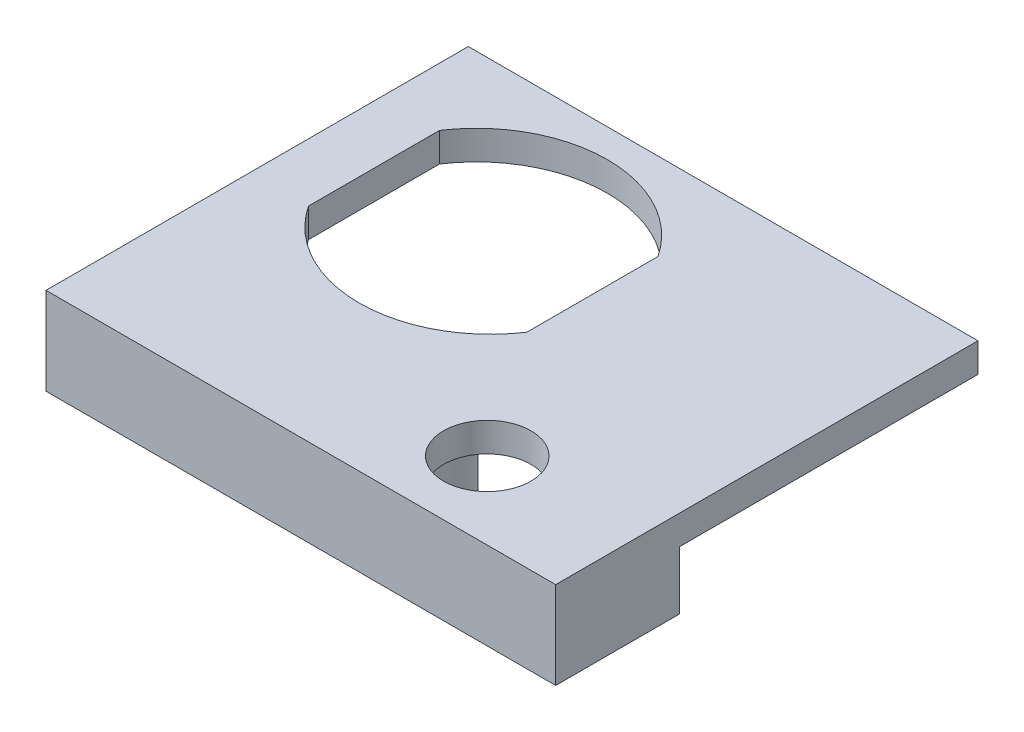
ISO-10303-21;
HEADER;
FILE_DESCRIPTION(('STEP AP214'),'2;1');
FILE_NAME('part.step','',(''),(''),'','','');
FILE_SCHEMA(('AUTOMOTIVE_DESIGN { 1 0 10303 214 1 1 1 1 }'));
ENDSEC;
DATA;
#1=APPLICATION_CONTEXT('core data for automotive mechanical design processes');
#2=APPLICATION_PROTOCOL_DEFINITION('international standard','automotive_design',2000,#1);
#3=PRODUCT_CONTEXT('',#1,'mechanical');
#4=PRODUCT('Part','Part','',(#3));
#5=PRODUCT_RELATED_PRODUCT_CATEGORY('part','',(#4));
#6=PRODUCT_DEFINITION_FORMATION('','',#4);
#7=PRODUCT_DEFINITION_CONTEXT('part definition',#1,'design');
#8=PRODUCT_DEFINITION('design','',#6,#7);
#9=PRODUCT_DEFINITION_SHAPE('','',#8);
#10=(LENGTH_UNIT() NAMED_UNIT(*) SI_UNIT(.MILLI.,.METRE.));
#11=(NAMED_UNIT(*) PLANE_ANGLE_UNIT() SI_UNIT($,.RADIAN.));
#12=(NAMED_UNIT(*) SI_UNIT($,.STERADIAN.) SOLID_ANGLE_UNIT());
#13=UNCERTAINTY_MEASURE_WITH_UNIT(LENGTH_MEASURE(1.E-05),#10,'distance_accuracy_value','');
#14=(GEOMETRIC_REPRESENTATION_CONTEXT(3) GLOBAL_UNCERTAINTY_ASSIGNED_CONTEXT((#13)) GLOBAL_UNIT_ASSIGNED_CONTEXT((#10,
#11,#12)) REPRESENTATION_CONTEXT('',''));
#15=CARTESIAN_POINT('',(0.,0.,0.));
#16=DIRECTION('',(0.,0.,1.));
#17=DIRECTION('',(1.,0.,0.));
#18=AXIS2_PLACEMENT_3D('',#15,#16,#17);
#19=CARTESIAN_POINT('',(0.,0.,0.));
#20=DIRECTION('',(0.,1.,0.));
#21=DIRECTION('',(0.,0.,1.));
#22=AXIS2_PLACEMENT_3D('',#19,#20,#21);
#23=PLANE('',#22);
#24=DIRECTION('',(1.,0.,0.));
#25=VECTOR('',#24,1.);
#26=CARTESIAN_POINT('',(5.67093727122986,0.,3.));
#27=LINE('',#26,#25);
#28=CARTESIAN_POINT('',(5.67093727122986,0.,3.));
#29=VERTEX_POINT('',#28);
#30=CARTESIAN_POINT('',(8.75,0.,3.));
#31=VERTEX_POINT('',#30);
#32=EDGE_CURVE('E183',#29,#31,#27,.T.);
#33=ORIENTED_EDGE('',*,*,#32,.F.);
#34=CARTESIAN_POINT('',(3.75,0.,4.6));
#35=DIRECTION('',(0.,1.,0.));
#36=DIRECTION('',(0.,0.,-1.));
#37=AXIS2_PLACEMENT_3D('',#34,#35,#36);
#38=CIRCLE('',#37,2.5);
#39=CARTESIAN_POINT('',(1.82906272877015,0.,3.));
#40=VERTEX_POINT('',#39);
#41=EDGE_CURVE('E173',#40,#29,#38,.T.);
#42=ORIENTED_EDGE('',*,*,#41,.F.);
#43=DIRECTION('',(1.,0.,0.));
#44=VECTOR('',#43,1.);
#45=CARTESIAN_POINT('',(-8.75,0.,3.));
#46=LINE('',#45,#44);
#47=CARTESIAN_POINT('',(-8.75,0.,3.));
#48=VERTEX_POINT('',#47);
#49=EDGE_CURVE('E170',#48,#40,#46,.T.);
#50=ORIENTED_EDGE('',*,*,#49,.F.);
#51=DIRECTION('',(0.,0.,1.));
#52=VECTOR('',#51,1.);
#53=CARTESIAN_POINT('',(-8.75,0.,-7.25));
#54=LINE('',#53,#52);
#55=CARTESIAN_POINT('',(-8.75,0.,-7.25));
#56=VERTEX_POINT('',#55);
#57=EDGE_CURVE('E246',#56,#48,#54,.T.);
#58=ORIENTED_EDGE('',*,*,#57,.F.);
#59=DIRECTION('',(-1.,0.,0.));
#60=VECTOR('',#59,1.);
#61=CARTESIAN_POINT('',(-8.75,0.,-7.25));
#62=LINE('',#61,#60);
#63=CARTESIAN_POINT('',(8.75,0.,-7.25));
#64=VERTEX_POINT('',#63);
#65=EDGE_CURVE('E253',#64,#56,#62,.T.);
#66=ORIENTED_EDGE('',*,*,#65,.F.);
#67=DIRECTION('',(0.,0.,-1.));
#68=VECTOR('',#67,1.);
#69=CARTESIAN_POINT('',(8.75,0.,-7.25));
#70=LINE('',#69,#68);
#71=EDGE_CURVE('E262',#31,#64,#70,.T.);
#72=ORIENTED_EDGE('',*,*,#71,.F.);
#73=EDGE_LOOP('',(#33,#42,#50,#58,#66,#72));
#74=FACE_BOUND('',#73,.T.);
#75=CARTESIAN_POINT('',(3.75,0.,4.6));
#76=DIRECTION('',(0.,1.,0.));
#77=DIRECTION('',(0.,0.,1.));
#78=AXIS2_PLACEMENT_3D('',#75,#76,#77);
#79=CIRCLE('',#78,1.5);
#80=CARTESIAN_POINT('',(3.75,0.,6.1));
#81=VERTEX_POINT('',#80);
#82=EDGE_CURVE('E242',#81,#81,#79,.T.);
#83=ORIENTED_EDGE('',*,*,#82,.T.);
#84=EDGE_LOOP('',(#83));
#85=FACE_BOUND('',#84,.T.);
#86=CARTESIAN_POINT('',(-3.,0.,-1.77506281446689));
#87=DIRECTION('',(0.,1.,0.));
#88=DIRECTION('',(0.,0.,-1.));
#89=AXIS2_PLACEMENT_3D('',#86,#87,#88);
#90=CIRCLE('',#89,4.5);
#91=CARTESIAN_POINT('',(0.749999999999996,0.,-4.26253140723344));
#92=VERTEX_POINT('',#91);
#93=CARTESIAN_POINT('',(-6.75,0.,-4.26253140723344));
#94=VERTEX_POINT('',#93);
#95=EDGE_CURVE('E211',#92,#94,#90,.T.);
#96=ORIENTED_EDGE('',*,*,#95,.T.);
#97=DIRECTION('',(0.,0.,1.));
#98=VECTOR('',#97,1.);
#99=CARTESIAN_POINT('',(-6.75,0.,-4.26253140723344));
#100=LINE('',#99,#98);
#101=CARTESIAN_POINT('',(-6.74999999999999,0.,0.237468592766558));
#102=VERTEX_POINT('',#101);
#103=EDGE_CURVE('E225',#94,#102,#100,.T.);
#104=ORIENTED_EDGE('',*,*,#103,.T.);
#105=CARTESIAN_POINT('',(-3.,0.,-2.25));
#106=DIRECTION('',(0.,1.,0.));
#107=DIRECTION('',(0.,0.,1.));
#108=AXIS2_PLACEMENT_3D('',#105,#106,#107);
#109=CIRCLE('',#108,4.5);
#110=CARTESIAN_POINT('',(0.749999999999998,0.,0.237468592766558));
#111=VERTEX_POINT('',#110);
#112=EDGE_CURVE('E228',#102,#111,#109,.T.);
#113=ORIENTED_EDGE('',*,*,#112,.T.);
#114=DIRECTION('',(0.,0.,-1.));
#115=VECTOR('',#114,1.);
#116=CARTESIAN_POINT('',(0.749999999999996,0.,-4.26253140723344));
#117=LINE('',#116,#115);
#118=EDGE_CURVE('E215',#111,#92,#117,.T.);
#119=ORIENTED_EDGE('',*,*,#118,.T.);
#120=EDGE_LOOP('',(#96,#104,#113,#119));
#121=FACE_BOUND('',#120,.T.);
#122=DIRECTION('',(0.,0.,-1.));
#123=VECTOR('',#122,1.);
#124=CARTESIAN_POINT('',(1.75,0.,2.25));
#125=LINE('',#124,#123);
#126=CARTESIAN_POINT('',(1.75,0.,2.25));
#127=VERTEX_POINT('',#126);
#128=CARTESIAN_POINT('',(1.75,0.,-3.75));
#129=VERTEX_POINT('',#128);
#130=EDGE_CURVE('E169',#127,#129,#125,.T.);
#131=ORIENTED_EDGE('',*,*,#130,.F.);
#132=DIRECTION('',(-1.,0.,0.));
#133=VECTOR('',#132,1.);
#134=CARTESIAN_POINT('',(1.75,0.,2.25));
#135=LINE('',#134,#133);
#136=CARTESIAN_POINT('',(3.75,0.,2.25));
#137=VERTEX_POINT('',#136);
#138=EDGE_CURVE('E166',#137,#127,#135,.T.);
#139=ORIENTED_EDGE('',*,*,#138,.F.);
#140=DIRECTION('',(0.,0.,1.));
#141=VECTOR('',#140,1.);
#142=CARTESIAN_POINT('',(3.75,0.,2.25));
#143=LINE('',#142,#141);
#144=CARTESIAN_POINT('',(3.75,0.,-3.75));
#145=VERTEX_POINT('',#144);
#146=EDGE_CURVE('E57',#145,#137,#143,.T.);
#147=ORIENTED_EDGE('',*,*,#146,.F.);
#148=DIRECTION('',(1.,0.,0.));
#149=VECTOR('',#148,1.);
#150=CARTESIAN_POINT('',(1.75,0.,-3.75));
#151=LINE('',#150,#149);
#152=EDGE_CURVE('E52',#129,#145,#151,.T.);
#153=ORIENTED_EDGE('',*,*,#152,.F.);
#154=EDGE_LOOP('',(#131,#139,#147,#153));
#155=FACE_BOUND('',#154,.T.);
#156=ADVANCED_FACE('F37',(#74,#85,#121,#155),#23,.F.);
#157=CARTESIAN_POINT('',(0.,1.,0.));
#158=DIRECTION('',(0.,1.,0.));
#159=DIRECTION('',(0.,0.,1.));
#160=AXIS2_PLACEMENT_3D('',#157,#158,#159);
#161=PLANE('',#160);
#162=DIRECTION('',(0.,0.,1.));
#163=VECTOR('',#162,1.);
#164=CARTESIAN_POINT('',(-8.75,1.,-7.25));
#165=LINE('',#164,#163);
#166=CARTESIAN_POINT('',(-8.75,1.,-7.25));
#167=VERTEX_POINT('',#166);
#168=CARTESIAN_POINT('',(-8.75,1.,7.25));
#169=VERTEX_POINT('',#168);
#170=EDGE_CURVE('E249',#167,#169,#165,.T.);
#171=ORIENTED_EDGE('',*,*,#170,.T.);
#172=DIRECTION('',(1.,0.,0.));
#173=VECTOR('',#172,1.);
#174=CARTESIAN_POINT('',(-8.75,1.,7.25));
#175=LINE('',#174,#173);
#176=CARTESIAN_POINT('',(8.75,1.,7.25));
#177=VERTEX_POINT('',#176);
#178=EDGE_CURVE('E252',#169,#177,#175,.T.);
#179=ORIENTED_EDGE('',*,*,#178,.T.);
#180=DIRECTION('',(0.,0.,-1.));
#181=VECTOR('',#180,1.);
#182=CARTESIAN_POINT('',(8.75,1.,-7.25));
#183=LINE('',#182,#181);
#184=CARTESIAN_POINT('',(8.75,1.,-7.25));
#185=VERTEX_POINT('',#184);
#186=EDGE_CURVE('E255',#177,#185,#183,.T.);
#187=ORIENTED_EDGE('',*,*,#186,.T.);
#188=DIRECTION('',(-1.,0.,0.));
#189=VECTOR('',#188,1.);
#190=CARTESIAN_POINT('',(0.749999999999995,1.,-7.25));
#191=LINE('',#190,#189);
#192=EDGE_CURVE('E257',#185,#167,#191,.T.);
#193=ORIENTED_EDGE('',*,*,#192,.T.);
#194=EDGE_LOOP('',(#171,#179,#187,#193));
#195=FACE_BOUND('',#194,.T.);
#196=CARTESIAN_POINT('',(3.75,1.,4.6));
#197=DIRECTION('',(0.,1.,0.));
#198=DIRECTION('',(0.,0.,1.));
#199=AXIS2_PLACEMENT_3D('',#196,#197,#198);
#200=CIRCLE('',#199,1.5);
#201=CARTESIAN_POINT('',(3.75,1.,6.1));
#202=VERTEX_POINT('',#201);
#203=EDGE_CURVE('E243',#202,#202,#200,.T.);
#204=ORIENTED_EDGE('',*,*,#203,.F.);
#205=EDGE_LOOP('',(#204));
#206=FACE_BOUND('',#205,.T.);
#207=DIRECTION('',(0.,0.,1.));
#208=VECTOR('',#207,1.);
#209=CARTESIAN_POINT('',(-6.75,1.,-4.26253140723344));
#210=LINE('',#209,#208);
#211=CARTESIAN_POINT('',(-6.75,1.,-4.26253140723344));
#212=VERTEX_POINT('',#211);
#213=CARTESIAN_POINT('',(-6.74999999999999,1.,0.237468592766558));
#214=VERTEX_POINT('',#213);
#215=EDGE_CURVE('E214',#212,#214,#210,.T.);
#216=ORIENTED_EDGE('',*,*,#215,.F.);
#217=CARTESIAN_POINT('',(-3.,1.,-1.77506281446689));
#218=DIRECTION('',(0.,1.,0.));
#219=DIRECTION('',(0.,0.,-1.));
#220=AXIS2_PLACEMENT_3D('',#217,#218,#219);
#221=CIRCLE('',#220,4.5);
#222=CARTESIAN_POINT('',(0.749999999999996,1.,-4.26253140723344));
#223=VERTEX_POINT('',#222);
#224=EDGE_CURVE('E212',#223,#212,#221,.T.);
#225=ORIENTED_EDGE('',*,*,#224,.F.);
#226=DIRECTION('',(0.,0.,-1.));
#227=VECTOR('',#226,1.);
#228=CARTESIAN_POINT('',(0.749999999999996,1.,-4.26253140723344));
#229=LINE('',#228,#227);
#230=CARTESIAN_POINT('',(0.749999999999998,1.,0.237468592766558));
#231=VERTEX_POINT('',#230);
#232=EDGE_CURVE('E220',#231,#223,#229,.T.);
#233=ORIENTED_EDGE('',*,*,#232,.F.);
#234=CARTESIAN_POINT('',(-3.,1.,-2.25));
#235=DIRECTION('',(0.,1.,0.));
#236=DIRECTION('',(0.,0.,1.));
#237=AXIS2_PLACEMENT_3D('',#234,#235,#236);
#238=CIRCLE('',#237,4.5);
#239=EDGE_CURVE('E217',#214,#231,#238,.T.);
#240=ORIENTED_EDGE('',*,*,#239,.F.);
#241=EDGE_LOOP('',(#216,#225,#233,#240));
#242=FACE_BOUND('',#241,.T.);
#243=ADVANCED_FACE('F305',(#195,#206,#242),#161,.T.);
#244=CARTESIAN_POINT('',(-8.75,1.,-7.25));
#245=DIRECTION('',(1.,0.,0.));
#246=DIRECTION('',(0.,0.,-1.));
#247=AXIS2_PLACEMENT_3D('',#244,#245,#246);
#248=PLANE('',#247);
#249=ORIENTED_EDGE('',*,*,#57,.T.);
#250=DIRECTION('',(0.,1.,0.));
#251=VECTOR('',#250,1.);
#252=CARTESIAN_POINT('',(-8.75,-2.,3.));
#253=LINE('',#252,#251);
#254=CARTESIAN_POINT('',(-8.75,-2.,3.));
#255=VERTEX_POINT('',#254);
#256=EDGE_CURVE('E208',#255,#48,#253,.T.);
#257=ORIENTED_EDGE('',*,*,#256,.F.);
#258=DIRECTION('',(0.,0.,-1.));
#259=VECTOR('',#258,1.);
#260=CARTESIAN_POINT('',(-8.75,-2.,7.25));
#261=LINE('',#260,#259);
#262=CARTESIAN_POINT('',(-8.75,-2.,7.25));
#263=VERTEX_POINT('',#262);
#264=EDGE_CURVE('E179',#263,#255,#261,.T.);
#265=ORIENTED_EDGE('',*,*,#264,.F.);
#266=DIRECTION('',(0.,-1.,0.));
#267=VECTOR('',#266,1.);
#268=CARTESIAN_POINT('',(-8.75,1.,7.25));
#269=LINE('',#268,#267);
#270=EDGE_CURVE('E11',#169,#263,#269,.T.);
#271=ORIENTED_EDGE('',*,*,#270,.F.);
#272=ORIENTED_EDGE('',*,*,#170,.F.);
#273=DIRECTION('',(0.,-1.,0.));
#274=VECTOR('',#273,1.);
#275=CARTESIAN_POINT('',(-8.75,1.,-7.25));
#276=LINE('',#275,#274);
#277=EDGE_CURVE('E259',#167,#56,#276,.T.);
#278=ORIENTED_EDGE('',*,*,#277,.T.);
#279=EDGE_LOOP('',(#249,#257,#265,#271,#272,#278));
#280=FACE_BOUND('',#279,.T.);
#281=ADVANCED_FACE('F39',(#280),#248,.F.);
#282=CARTESIAN_POINT('',(-8.75,1.,7.25));
#283=DIRECTION('',(0.,0.,-1.));
#284=DIRECTION('',(-1.,0.,0.));
#285=AXIS2_PLACEMENT_3D('',#282,#283,#284);
#286=PLANE('',#285);
#287=ORIENTED_EDGE('',*,*,#270,.T.);
#288=DIRECTION('',(-1.,0.,0.));
#289=VECTOR('',#288,1.);
#290=CARTESIAN_POINT('',(-8.75,-2.,7.25));
#291=LINE('',#290,#289);
#292=CARTESIAN_POINT('',(8.75,-2.,7.25));
#293=VERTEX_POINT('',#292);
#294=EDGE_CURVE('E192',#293,#263,#291,.T.);
#295=ORIENTED_EDGE('',*,*,#294,.F.);
#296=DIRECTION('',(0.,-1.,0.));
#297=VECTOR('',#296,1.);
#298=CARTESIAN_POINT('',(8.75,1.,7.25));
#299=LINE('',#298,#297);
#300=EDGE_CURVE('E45',#177,#293,#299,.T.);
#301=ORIENTED_EDGE('',*,*,#300,.F.);
#302=ORIENTED_EDGE('',*,*,#178,.F.);
#303=EDGE_LOOP('',(#287,#295,#301,#302));
#304=FACE_BOUND('',#303,.T.);
#305=ADVANCED_FACE('F282',(#304),#286,.F.);
#306=CARTESIAN_POINT('',(8.75,1.,-7.25));
#307=DIRECTION('',(-1.,0.,0.));
#308=DIRECTION('',(0.,0.,1.));
#309=AXIS2_PLACEMENT_3D('',#306,#307,#308);
#310=PLANE('',#309);
#311=ORIENTED_EDGE('',*,*,#300,.T.);
#312=DIRECTION('',(0.,0.,1.));
#313=VECTOR('',#312,1.);
#314=CARTESIAN_POINT('',(8.75,-2.,7.25));
#315=LINE('',#314,#313);
#316=CARTESIAN_POINT('',(8.75,-2.,3.));
#317=VERTEX_POINT('',#316);
#318=EDGE_CURVE('E189',#317,#293,#315,.T.);
#319=ORIENTED_EDGE('',*,*,#318,.F.);
#320=DIRECTION('',(0.,1.,0.));
#321=VECTOR('',#320,1.);
#322=CARTESIAN_POINT('',(8.75,-2.,3.));
#323=LINE('',#322,#321);
#324=EDGE_CURVE('E194',#317,#31,#323,.T.);
#325=ORIENTED_EDGE('',*,*,#324,.T.);
#326=ORIENTED_EDGE('',*,*,#71,.T.);
#327=DIRECTION('',(0.,-1.,0.));
#328=VECTOR('',#327,1.);
#329=CARTESIAN_POINT('',(8.75,1.,-7.25));
#330=LINE('',#329,#328);
#331=EDGE_CURVE('E267',#185,#64,#330,.T.);
#332=ORIENTED_EDGE('',*,*,#331,.F.);
#333=ORIENTED_EDGE('',*,*,#186,.F.);
#334=EDGE_LOOP('',(#311,#319,#325,#326,#332,#333));
#335=FACE_BOUND('',#334,.T.);
#336=ADVANCED_FACE('F273',(#335),#310,.F.);
#337=CARTESIAN_POINT('',(-8.75,1.,-7.25));
#338=DIRECTION('',(0.,0.,1.));
#339=DIRECTION('',(1.,0.,0.));
#340=AXIS2_PLACEMENT_3D('',#337,#338,#339);
#341=PLANE('',#340);
#342=ORIENTED_EDGE('',*,*,#65,.T.);
#343=ORIENTED_EDGE('',*,*,#277,.F.);
#344=ORIENTED_EDGE('',*,*,#192,.F.);
#345=ORIENTED_EDGE('',*,*,#331,.T.);
#346=EDGE_LOOP('',(#342,#343,#344,#345));
#347=FACE_BOUND('',#346,.T.);
#348=ADVANCED_FACE('F303',(#347),#341,.F.);
#349=CARTESIAN_POINT('',(3.75,1.,4.6));
#350=DIRECTION('',(0.,-1.,0.));
#351=DIRECTION('',(0.,0.,-1.));
#352=AXIS2_PLACEMENT_3D('',#349,#350,#351);
#353=CYLINDRICAL_SURFACE('',#352,1.5);
#354=ORIENTED_EDGE('',*,*,#203,.T.);
#355=EDGE_LOOP('',(#354));
#356=FACE_BOUND('',#355,.T.);
#357=ORIENTED_EDGE('',*,*,#82,.F.);
#358=EDGE_LOOP('',(#357));
#359=FACE_BOUND('',#358,.T.);
#360=ADVANCED_FACE('F345',(#356,#359),#353,.F.);
#361=CARTESIAN_POINT('',(-3.,1.,-1.77506281446689));
#362=DIRECTION('',(0.,-1.,0.));
#363=DIRECTION('',(0.,0.,-1.));
#364=AXIS2_PLACEMENT_3D('',#361,#362,#363);
#365=CYLINDRICAL_SURFACE('',#364,4.5);
#366=ORIENTED_EDGE('',*,*,#95,.F.);
#367=DIRECTION('',(0.,-1.,0.));
#368=VECTOR('',#367,1.);
#369=CARTESIAN_POINT('',(0.749999999999996,1.,-4.26253140723344));
#370=LINE('',#369,#368);
#371=EDGE_CURVE('E222',#223,#92,#370,.T.);
#372=ORIENTED_EDGE('',*,*,#371,.F.);
#373=ORIENTED_EDGE('',*,*,#224,.T.);
#374=DIRECTION('',(0.,-1.,0.));
#375=VECTOR('',#374,1.);
#376=CARTESIAN_POINT('',(-6.75,1.,-4.26253140723344));
#377=LINE('',#376,#375);
#378=EDGE_CURVE('E239',#212,#94,#377,.T.);
#379=ORIENTED_EDGE('',*,*,#378,.T.);
#380=EDGE_LOOP('',(#366,#372,#373,#379));
#381=FACE_BOUND('',#380,.T.);
#382=ADVANCED_FACE('F325',(#381),#365,.F.);
#383=CARTESIAN_POINT('',(-6.75,1.,-4.26253140723344));
#384=DIRECTION('',(1.,0.,0.));
#385=DIRECTION('',(0.,0.,-1.));
#386=AXIS2_PLACEMENT_3D('',#383,#384,#385);
#387=PLANE('',#386);
#388=ORIENTED_EDGE('',*,*,#103,.F.);
#389=ORIENTED_EDGE('',*,*,#378,.F.);
#390=ORIENTED_EDGE('',*,*,#215,.T.);
#391=DIRECTION('',(0.,-1.,0.));
#392=VECTOR('',#391,1.);
#393=CARTESIAN_POINT('',(-6.74999999999999,1.,0.237468592766558));
#394=LINE('',#393,#392);
#395=EDGE_CURVE('E237',#214,#102,#394,.T.);
#396=ORIENTED_EDGE('',*,*,#395,.T.);
#397=EDGE_LOOP('',(#388,#389,#390,#396));
#398=FACE_BOUND('',#397,.T.);
#399=ADVANCED_FACE('F318',(#398),#387,.T.);
#400=CARTESIAN_POINT('',(-3.,1.,-2.25));
#401=DIRECTION('',(0.,-1.,0.));
#402=DIRECTION('',(0.,0.,-1.));
#403=AXIS2_PLACEMENT_3D('',#400,#401,#402);
#404=CYLINDRICAL_SURFACE('',#403,4.5);
#405=ORIENTED_EDGE('',*,*,#112,.F.);
#406=ORIENTED_EDGE('',*,*,#395,.F.);
#407=ORIENTED_EDGE('',*,*,#239,.T.);
#408=DIRECTION('',(0.,-1.,0.));
#409=VECTOR('',#408,1.);
#410=CARTESIAN_POINT('',(0.749999999999998,1.,0.237468592766558));
#411=LINE('',#410,#409);
#412=EDGE_CURVE('E235',#231,#111,#411,.T.);
#413=ORIENTED_EDGE('',*,*,#412,.T.);
#414=EDGE_LOOP('',(#405,#406,#407,#413));
#415=FACE_BOUND('',#414,.T.);
#416=ADVANCED_FACE('F321',(#415),#404,.F.);
#417=CARTESIAN_POINT('',(0.749999999999996,1.,-4.26253140723344));
#418=DIRECTION('',(-1.,0.,0.));
#419=DIRECTION('',(0.,0.,1.));
#420=AXIS2_PLACEMENT_3D('',#417,#418,#419);
#421=PLANE('',#420);
#422=ORIENTED_EDGE('',*,*,#118,.F.);
#423=ORIENTED_EDGE('',*,*,#412,.F.);
#424=ORIENTED_EDGE('',*,*,#232,.T.);
#425=ORIENTED_EDGE('',*,*,#371,.T.);
#426=EDGE_LOOP('',(#422,#423,#424,#425));
#427=FACE_BOUND('',#426,.T.);
#428=ADVANCED_FACE('F328',(#427),#421,.T.);
#429=CARTESIAN_POINT('',(-8.75,-2.,3.));
#430=DIRECTION('',(0.,0.,1.));
#431=DIRECTION('',(1.,0.,0.));
#432=AXIS2_PLACEMENT_3D('',#429,#430,#431);
#433=PLANE('',#432);
#434=ORIENTED_EDGE('',*,*,#49,.T.);
#435=DIRECTION('',(0.,1.,0.));
#436=VECTOR('',#435,1.);
#437=CARTESIAN_POINT('',(1.82906272877015,-2.,3.));
#438=LINE('',#437,#436);
#439=CARTESIAN_POINT('',(1.82906272877015,-2.,3.));
#440=VERTEX_POINT('',#439);
#441=EDGE_CURVE('E205',#440,#40,#438,.T.);
#442=ORIENTED_EDGE('',*,*,#441,.F.);
#443=DIRECTION('',(1.,0.,0.));
#444=VECTOR('',#443,1.);
#445=CARTESIAN_POINT('',(-8.75,-2.,3.));
#446=LINE('',#445,#444);
#447=EDGE_CURVE('E182',#255,#440,#446,.T.);
#448=ORIENTED_EDGE('',*,*,#447,.F.);
#449=ORIENTED_EDGE('',*,*,#256,.T.);
#450=EDGE_LOOP('',(#434,#442,#448,#449));
#451=FACE_BOUND('',#450,.T.);
#452=ADVANCED_FACE('F291',(#451),#433,.F.);
#453=CARTESIAN_POINT('',(3.75,-2.,4.6));
#454=DIRECTION('',(0.,1.,0.));
#455=DIRECTION('',(0.,0.,1.));
#456=AXIS2_PLACEMENT_3D('',#453,#454,#455);
#457=CYLINDRICAL_SURFACE('',#456,2.5);
#458=ORIENTED_EDGE('',*,*,#41,.T.);
#459=DIRECTION('',(0.,1.,0.));
#460=VECTOR('',#459,1.);
#461=CARTESIAN_POINT('',(5.67093727122986,-2.,3.));
#462=LINE('',#461,#460);
#463=CARTESIAN_POINT('',(5.67093727122986,-2.,3.));
#464=VERTEX_POINT('',#463);
#465=EDGE_CURVE('E202',#464,#29,#462,.T.);
#466=ORIENTED_EDGE('',*,*,#465,.F.);
#467=CARTESIAN_POINT('',(3.75,-2.,4.6));
#468=DIRECTION('',(0.,1.,0.));
#469=DIRECTION('',(0.,0.,-1.));
#470=AXIS2_PLACEMENT_3D('',#467,#468,#469);
#471=CIRCLE('',#470,2.5);
#472=EDGE_CURVE('E185',#440,#464,#471,.T.);
#473=ORIENTED_EDGE('',*,*,#472,.F.);
#474=ORIENTED_EDGE('',*,*,#441,.T.);
#475=EDGE_LOOP('',(#458,#466,#473,#474));
#476=FACE_BOUND('',#475,.T.);
#477=ADVANCED_FACE('F293',(#476),#457,.F.);
#478=CARTESIAN_POINT('',(5.67093727122986,-2.,3.));
#479=DIRECTION('',(0.,0.,1.));
#480=DIRECTION('',(1.,0.,0.));
#481=AXIS2_PLACEMENT_3D('',#478,#479,#480);
#482=PLANE('',#481);
#483=ORIENTED_EDGE('',*,*,#32,.T.);
#484=ORIENTED_EDGE('',*,*,#324,.F.);
#485=DIRECTION('',(1.,0.,0.));
#486=VECTOR('',#485,1.);
#487=CARTESIAN_POINT('',(5.67093727122986,-2.,3.));
#488=LINE('',#487,#486);
#489=EDGE_CURVE('E187',#464,#317,#488,.T.);
#490=ORIENTED_EDGE('',*,*,#489,.F.);
#491=ORIENTED_EDGE('',*,*,#465,.T.);
#492=EDGE_LOOP('',(#483,#484,#490,#491));
#493=FACE_BOUND('',#492,.T.);
#494=ADVANCED_FACE('F295',(#493),#482,.F.);
#495=CARTESIAN_POINT('',(3.75,-2.,4.6));
#496=DIRECTION('',(0.,-1.,0.));
#497=DIRECTION('',(0.,0.,-1.));
#498=AXIS2_PLACEMENT_3D('',#495,#496,#497);
#499=PLANE('',#498);
#500=ORIENTED_EDGE('',*,*,#264,.T.);
#501=ORIENTED_EDGE('',*,*,#447,.T.);
#502=ORIENTED_EDGE('',*,*,#472,.T.);
#503=ORIENTED_EDGE('',*,*,#489,.T.);
#504=ORIENTED_EDGE('',*,*,#318,.T.);
#505=ORIENTED_EDGE('',*,*,#294,.T.);
#506=EDGE_LOOP('',(#500,#501,#502,#503,#504,#505));
#507=FACE_BOUND('',#506,.T.);
#508=ADVANCED_FACE('F278',(#507),#499,.T.);
#509=CARTESIAN_POINT('',(1.75,-0.5,2.25));
#510=DIRECTION('',(1.,0.,0.));
#511=DIRECTION('',(0.,0.,-1.));
#512=AXIS2_PLACEMENT_3D('',#509,#510,#511);
#513=PLANE('',#512);
#514=ORIENTED_EDGE('',*,*,#130,.T.);
#515=DIRECTION('',(0.,1.,0.));
#516=VECTOR('',#515,1.);
#517=CARTESIAN_POINT('',(1.75,-0.5,-3.75));
#518=LINE('',#517,#516);
#519=CARTESIAN_POINT('',(1.75,-0.5,-3.75));
#520=VERTEX_POINT('',#519);
#521=EDGE_CURVE('E150',#520,#129,#518,.T.);
#522=ORIENTED_EDGE('',*,*,#521,.F.);
#523=DIRECTION('',(0.,0.,-1.));
#524=VECTOR('',#523,1.);
#525=CARTESIAN_POINT('',(1.75,-0.5,2.25));
#526=LINE('',#525,#524);
#527=CARTESIAN_POINT('',(1.75,-0.5,2.25));
#528=VERTEX_POINT('',#527);
#529=EDGE_CURVE('E157',#528,#520,#526,.T.);
#530=ORIENTED_EDGE('',*,*,#529,.F.);
#531=DIRECTION('',(0.,1.,0.));
#532=VECTOR('',#531,1.);
#533=CARTESIAN_POINT('',(1.75,-0.5,2.25));
#534=LINE('',#533,#532);
#535=EDGE_CURVE('E533',#528,#127,#534,.T.);
#536=ORIENTED_EDGE('',*,*,#535,.T.);
#537=EDGE_LOOP('',(#514,#522,#530,#536));
#538=FACE_BOUND('',#537,.T.);
#539=ADVANCED_FACE('F168',(#538),#513,.F.);
#540=CARTESIAN_POINT('',(1.75,-0.5,-3.75));
#541=DIRECTION('',(0.,0.,1.));
#542=DIRECTION('',(1.,0.,0.));
#543=AXIS2_PLACEMENT_3D('',#540,#541,#542);
#544=PLANE('',#543);
#545=ORIENTED_EDGE('',*,*,#152,.T.);
#546=DIRECTION('',(0.,1.,0.));
#547=VECTOR('',#546,1.);
#548=CARTESIAN_POINT('',(3.75,-0.5,-3.75));
#549=LINE('',#548,#547);
#550=CARTESIAN_POINT('',(3.75,-0.5,-3.75));
#551=VERTEX_POINT('',#550);
#552=EDGE_CURVE('E153',#551,#145,#549,.T.);
#553=ORIENTED_EDGE('',*,*,#552,.F.);
#554=DIRECTION('',(1.,0.,0.));
#555=VECTOR('',#554,1.);
#556=CARTESIAN_POINT('',(1.75,-0.5,-3.75));
#557=LINE('',#556,#555);
#558=EDGE_CURVE('E146',#520,#551,#557,.T.);
#559=ORIENTED_EDGE('',*,*,#558,.F.);
#560=ORIENTED_EDGE('',*,*,#521,.T.);
#561=EDGE_LOOP('',(#545,#553,#559,#560));
#562=FACE_BOUND('',#561,.T.);
#563=ADVANCED_FACE('F148',(#562),#544,.F.);
#564=CARTESIAN_POINT('',(3.75,-0.5,2.25));
#565=DIRECTION('',(-1.,0.,0.));
#566=DIRECTION('',(0.,0.,1.));
#567=AXIS2_PLACEMENT_3D('',#564,#565,#566);
#568=PLANE('',#567);
#569=ORIENTED_EDGE('',*,*,#146,.T.);
#570=DIRECTION('',(0.,1.,0.));
#571=VECTOR('',#570,1.);
#572=CARTESIAN_POINT('',(3.75,-0.5,2.25));
#573=LINE('',#572,#571);
#574=CARTESIAN_POINT('',(3.75,-0.5,2.25));
#575=VERTEX_POINT('',#574);
#576=EDGE_CURVE('E175',#575,#137,#573,.T.);
#577=ORIENTED_EDGE('',*,*,#576,.F.);
#578=DIRECTION('',(0.,0.,1.));
#579=VECTOR('',#578,1.);
#580=CARTESIAN_POINT('',(3.75,-0.5,2.25));
#581=LINE('',#580,#579);
#582=EDGE_CURVE('E156',#551,#575,#581,.T.);
#583=ORIENTED_EDGE('',*,*,#582,.F.);
#584=ORIENTED_EDGE('',*,*,#552,.T.);
#585=EDGE_LOOP('',(#569,#577,#583,#584));
#586=FACE_BOUND('',#585,.T.);
#587=ADVANCED_FACE('F489',(#586),#568,.F.);
#588=CARTESIAN_POINT('',(1.75,-0.5,2.25));
#589=DIRECTION('',(0.,0.,-1.));
#590=DIRECTION('',(-1.,0.,0.));
#591=AXIS2_PLACEMENT_3D('',#588,#589,#590);
#592=PLANE('',#591);
#593=ORIENTED_EDGE('',*,*,#138,.T.);
#594=ORIENTED_EDGE('',*,*,#535,.F.);
#595=DIRECTION('',(-1.,0.,0.));
#596=VECTOR('',#595,1.);
#597=CARTESIAN_POINT('',(1.75,-0.5,2.25));
#598=LINE('',#597,#596);
#599=EDGE_CURVE('E162',#575,#528,#598,.T.);
#600=ORIENTED_EDGE('',*,*,#599,.F.);
#601=ORIENTED_EDGE('',*,*,#576,.T.);
#602=EDGE_LOOP('',(#593,#594,#600,#601));
#603=FACE_BOUND('',#602,.T.);
#604=ADVANCED_FACE('F499',(#603),#592,.F.);
#605=CARTESIAN_POINT('',(0.,-0.5,0.));
#606=DIRECTION('',(0.,-1.,0.));
#607=DIRECTION('',(0.,0.,-1.));
#608=AXIS2_PLACEMENT_3D('',#605,#606,#607);
#609=PLANE('',#608);
#610=ORIENTED_EDGE('',*,*,#529,.T.);
#611=ORIENTED_EDGE('',*,*,#558,.T.);
#612=ORIENTED_EDGE('',*,*,#582,.T.);
#613=ORIENTED_EDGE('',*,*,#599,.T.);
#614=EDGE_LOOP('',(#610,#611,#612,#613));
#615=FACE_BOUND('',#614,.T.);
#616=ADVANCED_FACE('F160',(#615),#609,.T.);
#617=CLOSED_SHELL('',(#156,#243,#281,#305,#336,#348,#360,#382,#399,#416,#428,#452,#477,#494,
#508,#539,#563,#587,#604,#616));
#618=MANIFOLD_SOLID_BREP('B2',#617);
#619=ADVANCED_BREP_SHAPE_REPRESENTATION('',(#18,#618),#14);
#620=SHAPE_DEFINITION_REPRESENTATION(#9,#619);
ENDSEC;
END-ISO-10303-21;
